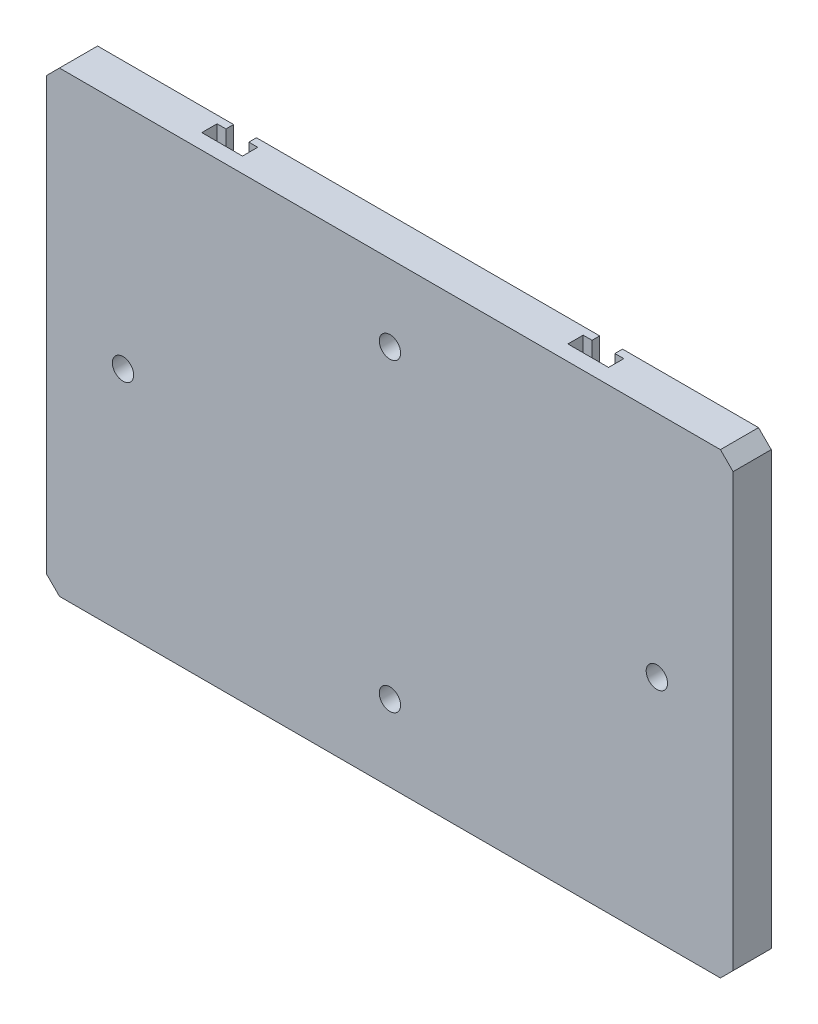
ISO-10303-21;
HEADER;
FILE_DESCRIPTION(('STEP AP214'),'2;1');
FILE_NAME('part.step','',(''),(''),'','','');
FILE_SCHEMA(('AUTOMOTIVE_DESIGN { 1 0 10303 214 1 1 1 1 }'));
ENDSEC;
DATA;
#1=APPLICATION_CONTEXT('core data for automotive mechanical design processes');
#2=APPLICATION_PROTOCOL_DEFINITION('international standard','automotive_design',2000,#1);
#3=PRODUCT_CONTEXT('',#1,'mechanical');
#4=PRODUCT('Part','Part','',(#3));
#5=PRODUCT_RELATED_PRODUCT_CATEGORY('part','',(#4));
#6=PRODUCT_DEFINITION_FORMATION('','',#4);
#7=PRODUCT_DEFINITION_CONTEXT('part definition',#1,'design');
#8=PRODUCT_DEFINITION('design','',#6,#7);
#9=PRODUCT_DEFINITION_SHAPE('','',#8);
#10=(LENGTH_UNIT() NAMED_UNIT(*) SI_UNIT(.MILLI.,.METRE.));
#11=(NAMED_UNIT(*) PLANE_ANGLE_UNIT() SI_UNIT($,.RADIAN.));
#12=(NAMED_UNIT(*) SI_UNIT($,.STERADIAN.) SOLID_ANGLE_UNIT());
#13=UNCERTAINTY_MEASURE_WITH_UNIT(LENGTH_MEASURE(1.E-05),#10,'distance_accuracy_value','');
#14=(GEOMETRIC_REPRESENTATION_CONTEXT(3) GLOBAL_UNCERTAINTY_ASSIGNED_CONTEXT((#13)) GLOBAL_UNIT_ASSIGNED_CONTEXT((#10,
#11,#12)) REPRESENTATION_CONTEXT('',''));
#15=CARTESIAN_POINT('',(0.,0.,0.));
#16=DIRECTION('',(0.,0.,1.));
#17=DIRECTION('',(1.,0.,0.));
#18=AXIS2_PLACEMENT_3D('',#15,#16,#17);
#19=CARTESIAN_POINT('',(0.,0.,0.));
#20=DIRECTION('',(0.,0.,-1.));
#21=DIRECTION('',(-1.,0.,0.));
#22=AXIS2_PLACEMENT_3D('',#19,#20,#21);
#23=PLANE('',#22);
#24=DIRECTION('',(0.,1.,0.));
#25=VECTOR('',#24,1.);
#26=CARTESIAN_POINT('',(202.5,0.,0.));
#27=LINE('',#26,#25);
#28=CARTESIAN_POINT('',(202.5,0.,0.));
#29=VERTEX_POINT('',#28);
#30=CARTESIAN_POINT('',(202.5,180.,0.));
#31=VERTEX_POINT('',#30);
#32=EDGE_CURVE('E254',#29,#31,#27,.T.);
#33=ORIENTED_EDGE('',*,*,#32,.F.);
#34=DIRECTION('',(1.,0.,0.));
#35=VECTOR('',#34,1.);
#36=CARTESIAN_POINT('',(0.,0.,0.));
#37=LINE('',#36,#35);
#38=CARTESIAN_POINT('',(67.5,0.,0.));
#39=VERTEX_POINT('',#38);
#40=EDGE_CURVE('E223',#39,#29,#37,.T.);
#41=ORIENTED_EDGE('',*,*,#40,.F.);
#42=DIRECTION('',(0.,1.,0.));
#43=VECTOR('',#42,1.);
#44=CARTESIAN_POINT('',(67.5,0.,0.));
#45=LINE('',#44,#43);
#46=CARTESIAN_POINT('',(67.5,180.,0.));
#47=VERTEX_POINT('',#46);
#48=EDGE_CURVE('E315',#39,#47,#45,.T.);
#49=ORIENTED_EDGE('',*,*,#48,.T.);
#50=DIRECTION('',(-1.,0.,0.));
#51=VECTOR('',#50,1.);
#52=CARTESIAN_POINT('',(0.,180.,0.));
#53=LINE('',#52,#51);
#54=EDGE_CURVE('E59',#31,#47,#53,.T.);
#55=ORIENTED_EDGE('',*,*,#54,.F.);
#56=EDGE_LOOP('',(#33,#41,#49,#55));
#57=FACE_BOUND('',#56,.T.);
#58=CARTESIAN_POINT('',(135.,150.,0.));
#59=DIRECTION('',(0.,0.,-1.));
#60=DIRECTION('',(-1.,0.,0.));
#61=AXIS2_PLACEMENT_3D('',#58,#59,#60);
#62=CIRCLE('',#61,7.50000000000001);
#63=CARTESIAN_POINT('',(127.5,150.,0.));
#64=VERTEX_POINT('',#63);
#65=EDGE_CURVE('E360',#64,#64,#62,.T.);
#66=ORIENTED_EDGE('',*,*,#65,.F.);
#67=EDGE_LOOP('',(#66));
#68=FACE_BOUND('',#67,.T.);
#69=CARTESIAN_POINT('',(135.,30.0000000000001,0.));
#70=DIRECTION('',(0.,0.,-1.));
#71=DIRECTION('',(-1.,0.,0.));
#72=AXIS2_PLACEMENT_3D('',#69,#70,#71);
#73=CIRCLE('',#72,7.50000000000001);
#74=CARTESIAN_POINT('',(127.5,30.0000000000001,0.));
#75=VERTEX_POINT('',#74);
#76=EDGE_CURVE('E348',#75,#75,#73,.T.);
#77=ORIENTED_EDGE('',*,*,#76,.F.);
#78=EDGE_LOOP('',(#77));
#79=FACE_BOUND('',#78,.T.);
#80=ADVANCED_FACE('F36',(#57,#68,#79),#23,.T.);
#81=DIRECTION('',(0.,1.,0.));
#82=VECTOR('',#81,1.);
#83=CARTESIAN_POINT('',(58.5,0.,0.));
#84=LINE('',#83,#82);
#85=CARTESIAN_POINT('',(58.5,0.,0.));
#86=VERTEX_POINT('',#85);
#87=CARTESIAN_POINT('',(58.5,180.,0.));
#88=VERTEX_POINT('',#87);
#89=EDGE_CURVE('E313',#86,#88,#84,.T.);
#90=ORIENTED_EDGE('',*,*,#89,.F.);
#91=CARTESIAN_POINT('',(5.00000000000006,0.,0.));
#92=VERTEX_POINT('',#91);
#93=EDGE_CURVE('E390',#92,#86,#37,.T.);
#94=ORIENTED_EDGE('',*,*,#93,.F.);
#95=DIRECTION('',(0.707106781186545,-0.70710678118655,0.));
#96=VECTOR('',#95,1.);
#97=CARTESIAN_POINT('',(2.50000000000004,2.50000000000003,0.));
#98=LINE('',#97,#96);
#99=CARTESIAN_POINT('',(0.,5.00000000000009,0.));
#100=VERTEX_POINT('',#99);
#101=EDGE_CURVE('E411',#92,#100,#98,.F.);
#102=ORIENTED_EDGE('',*,*,#101,.T.);
#103=DIRECTION('',(0.,-1.,0.));
#104=VECTOR('',#103,1.);
#105=CARTESIAN_POINT('',(0.,0.,0.));
#106=LINE('',#105,#104);
#107=CARTESIAN_POINT('',(0.,175.,0.));
#108=VERTEX_POINT('',#107);
#109=EDGE_CURVE('E372',#108,#100,#106,.T.);
#110=ORIENTED_EDGE('',*,*,#109,.F.);
#111=DIRECTION('',(-0.707106781186549,-0.707106781186546,0.));
#112=VECTOR('',#111,1.);
#113=CARTESIAN_POINT('',(-87.5,87.5000000000005,0.));
#114=LINE('',#113,#112);
#115=CARTESIAN_POINT('',(5.00000000000003,180.,0.));
#116=VERTEX_POINT('',#115);
#117=EDGE_CURVE('E403',#108,#116,#114,.F.);
#118=ORIENTED_EDGE('',*,*,#117,.T.);
#119=EDGE_CURVE('E396',#88,#116,#53,.T.);
#120=ORIENTED_EDGE('',*,*,#119,.F.);
#121=EDGE_LOOP('',(#90,#94,#102,#110,#118,#120));
#122=FACE_BOUND('',#121,.T.);
#123=CARTESIAN_POINT('',(30.,90.0000000000007,0.));
#124=DIRECTION('',(0.,0.,-1.));
#125=DIRECTION('',(-1.,0.,0.));
#126=AXIS2_PLACEMENT_3D('',#123,#124,#125);
#127=CIRCLE('',#126,7.5);
#128=CARTESIAN_POINT('',(22.5,90.0000000000007,0.));
#129=VERTEX_POINT('',#128);
#130=EDGE_CURVE('E336',#129,#129,#127,.T.);
#131=ORIENTED_EDGE('',*,*,#130,.F.);
#132=EDGE_LOOP('',(#131));
#133=FACE_BOUND('',#132,.T.);
#134=ADVANCED_FACE('F449',(#122,#133),#23,.T.);
#135=CARTESIAN_POINT('',(0.,0.,15.));
#136=DIRECTION('',(1.,0.,0.));
#137=DIRECTION('',(0.,0.,-1.));
#138=AXIS2_PLACEMENT_3D('',#135,#136,#137);
#139=PLANE('',#138);
#140=ORIENTED_EDGE('',*,*,#109,.T.);
#141=DIRECTION('',(0.,0.,1.));
#142=VECTOR('',#141,1.);
#143=CARTESIAN_POINT('',(0.,5.00000000000009,15.));
#144=LINE('',#143,#142);
#145=CARTESIAN_POINT('',(0.,5.00000000000009,15.));
#146=VERTEX_POINT('',#145);
#147=EDGE_CURVE('E416',#100,#146,#144,.T.);
#148=ORIENTED_EDGE('',*,*,#147,.T.);
#149=DIRECTION('',(0.,-1.,0.));
#150=VECTOR('',#149,1.);
#151=CARTESIAN_POINT('',(0.,0.,15.));
#152=LINE('',#151,#150);
#153=CARTESIAN_POINT('',(0.,175.,15.));
#154=VERTEX_POINT('',#153);
#155=EDGE_CURVE('E373',#154,#146,#152,.T.);
#156=ORIENTED_EDGE('',*,*,#155,.F.);
#157=DIRECTION('',(0.,0.,-1.));
#158=VECTOR('',#157,1.);
#159=CARTESIAN_POINT('',(0.,175.,15.));
#160=LINE('',#159,#158);
#161=EDGE_CURVE('E413',#154,#108,#160,.T.);
#162=ORIENTED_EDGE('',*,*,#161,.T.);
#163=EDGE_LOOP('',(#140,#148,#156,#162));
#164=FACE_BOUND('',#163,.T.);
#165=ADVANCED_FACE('F445',(#164),#139,.F.);
#166=CARTESIAN_POINT('',(0.,0.,15.));
#167=DIRECTION('',(0.,1.,0.));
#168=DIRECTION('',(0.,0.,1.));
#169=AXIS2_PLACEMENT_3D('',#166,#167,#168);
#170=PLANE('',#169);
#171=ORIENTED_EDGE('',*,*,#40,.T.);
#172=DIRECTION('',(0.,0.,1.));
#173=VECTOR('',#172,1.);
#174=CARTESIAN_POINT('',(202.5,0.,3.));
#175=LINE('',#174,#173);
#176=CARTESIAN_POINT('',(202.5,0.,3.));
#177=VERTEX_POINT('',#176);
#178=EDGE_CURVE('E202',#29,#177,#175,.T.);
#179=ORIENTED_EDGE('',*,*,#178,.T.);
#180=DIRECTION('',(-1.,0.,0.));
#181=VECTOR('',#180,1.);
#182=CARTESIAN_POINT('',(202.5,0.,3.));
#183=LINE('',#182,#181);
#184=CARTESIAN_POINT('',(199.,0.,3.));
#185=VERTEX_POINT('',#184);
#186=EDGE_CURVE('E212',#177,#185,#183,.T.);
#187=ORIENTED_EDGE('',*,*,#186,.T.);
#188=DIRECTION('',(0.,0.,1.));
#189=VECTOR('',#188,1.);
#190=CARTESIAN_POINT('',(199.,0.,9.));
#191=LINE('',#190,#189);
#192=CARTESIAN_POINT('',(199.,0.,9.));
#193=VERTEX_POINT('',#192);
#194=EDGE_CURVE('E217',#185,#193,#191,.T.);
#195=ORIENTED_EDGE('',*,*,#194,.T.);
#196=DIRECTION('',(1.,0.,0.));
#197=VECTOR('',#196,1.);
#198=CARTESIAN_POINT('',(215.,0.,9.));
#199=LINE('',#198,#197);
#200=CARTESIAN_POINT('',(215.,0.,9.));
#201=VERTEX_POINT('',#200);
#202=EDGE_CURVE('E229',#193,#201,#199,.T.);
#203=ORIENTED_EDGE('',*,*,#202,.T.);
#204=DIRECTION('',(0.,0.,-1.));
#205=VECTOR('',#204,1.);
#206=CARTESIAN_POINT('',(215.,0.,9.));
#207=LINE('',#206,#205);
#208=CARTESIAN_POINT('',(215.,0.,3.));
#209=VERTEX_POINT('',#208);
#210=EDGE_CURVE('E232',#201,#209,#207,.T.);
#211=ORIENTED_EDGE('',*,*,#210,.T.);
#212=DIRECTION('',(-1.,0.,0.));
#213=VECTOR('',#212,1.);
#214=CARTESIAN_POINT('',(215.,0.,3.));
#215=LINE('',#214,#213);
#216=CARTESIAN_POINT('',(211.5,0.,3.));
#217=VERTEX_POINT('',#216);
#218=EDGE_CURVE('E235',#209,#217,#215,.T.);
#219=ORIENTED_EDGE('',*,*,#218,.T.);
#220=DIRECTION('',(0.,0.,-1.));
#221=VECTOR('',#220,1.);
#222=CARTESIAN_POINT('',(211.5,0.,3.));
#223=LINE('',#222,#221);
#224=CARTESIAN_POINT('',(211.5,0.,0.));
#225=VERTEX_POINT('',#224);
#226=EDGE_CURVE('E209',#217,#225,#223,.T.);
#227=ORIENTED_EDGE('',*,*,#226,.T.);
#228=CARTESIAN_POINT('',(265.,0.,0.));
#229=VERTEX_POINT('',#228);
#230=EDGE_CURVE('E389',#225,#229,#37,.T.);
#231=ORIENTED_EDGE('',*,*,#230,.T.);
#232=DIRECTION('',(0.,0.,1.));
#233=VECTOR('',#232,1.);
#234=CARTESIAN_POINT('',(265.,0.,15.));
#235=LINE('',#234,#233);
#236=CARTESIAN_POINT('',(265.,0.,15.));
#237=VERTEX_POINT('',#236);
#238=EDGE_CURVE('E386',#229,#237,#235,.T.);
#239=ORIENTED_EDGE('',*,*,#238,.T.);
#240=DIRECTION('',(1.,0.,0.));
#241=VECTOR('',#240,1.);
#242=CARTESIAN_POINT('',(0.,0.,15.));
#243=LINE('',#242,#241);
#244=CARTESIAN_POINT('',(5.00000000000006,0.,15.));
#245=VERTEX_POINT('',#244);
#246=EDGE_CURVE('E376',#245,#237,#243,.T.);
#247=ORIENTED_EDGE('',*,*,#246,.F.);
#248=DIRECTION('',(0.,0.,-1.));
#249=VECTOR('',#248,1.);
#250=CARTESIAN_POINT('',(5.00000000000006,0.,15.));
#251=LINE('',#250,#249);
#252=EDGE_CURVE('E400',#245,#92,#251,.T.);
#253=ORIENTED_EDGE('',*,*,#252,.T.);
#254=ORIENTED_EDGE('',*,*,#93,.T.);
#255=DIRECTION('',(0.,0.,1.));
#256=VECTOR('',#255,1.);
#257=CARTESIAN_POINT('',(58.5,0.,3.));
#258=LINE('',#257,#256);
#259=CARTESIAN_POINT('',(58.5,0.,3.));
#260=VERTEX_POINT('',#259);
#261=EDGE_CURVE('E283',#86,#260,#258,.T.);
#262=ORIENTED_EDGE('',*,*,#261,.T.);
#263=DIRECTION('',(-1.,0.,0.));
#264=VECTOR('',#263,1.);
#265=CARTESIAN_POINT('',(55.,0.,3.));
#266=LINE('',#265,#264);
#267=CARTESIAN_POINT('',(55.,0.,3.));
#268=VERTEX_POINT('',#267);
#269=EDGE_CURVE('E286',#260,#268,#266,.T.);
#270=ORIENTED_EDGE('',*,*,#269,.T.);
#271=DIRECTION('',(0.,0.,1.));
#272=VECTOR('',#271,1.);
#273=CARTESIAN_POINT('',(55.,0.,9.));
#274=LINE('',#273,#272);
#275=CARTESIAN_POINT('',(55.,0.,9.));
#276=VERTEX_POINT('',#275);
#277=EDGE_CURVE('E268',#268,#276,#274,.T.);
#278=ORIENTED_EDGE('',*,*,#277,.T.);
#279=DIRECTION('',(1.,0.,0.));
#280=VECTOR('',#279,1.);
#281=CARTESIAN_POINT('',(55.,0.,9.));
#282=LINE('',#281,#280);
#283=CARTESIAN_POINT('',(71.,0.,9.));
#284=VERTEX_POINT('',#283);
#285=EDGE_CURVE('E271',#276,#284,#282,.T.);
#286=ORIENTED_EDGE('',*,*,#285,.T.);
#287=DIRECTION('',(0.,0.,-1.));
#288=VECTOR('',#287,1.);
#289=CARTESIAN_POINT('',(71.,0.,9.));
#290=LINE('',#289,#288);
#291=CARTESIAN_POINT('',(71.,0.,3.));
#292=VERTEX_POINT('',#291);
#293=EDGE_CURVE('E275',#284,#292,#290,.T.);
#294=ORIENTED_EDGE('',*,*,#293,.T.);
#295=DIRECTION('',(-1.,0.,0.));
#296=VECTOR('',#295,1.);
#297=CARTESIAN_POINT('',(67.5,0.,3.));
#298=LINE('',#297,#296);
#299=CARTESIAN_POINT('',(67.5,0.,3.));
#300=VERTEX_POINT('',#299);
#301=EDGE_CURVE('E278',#292,#300,#298,.T.);
#302=ORIENTED_EDGE('',*,*,#301,.T.);
#303=DIRECTION('',(0.,0.,-1.));
#304=VECTOR('',#303,1.);
#305=CARTESIAN_POINT('',(67.5,0.,3.));
#306=LINE('',#305,#304);
#307=EDGE_CURVE('E281',#300,#39,#306,.T.);
#308=ORIENTED_EDGE('',*,*,#307,.T.);
#309=EDGE_LOOP('',(#171,#179,#187,#195,#203,#211,#219,#227,#231,#239,#247,#253,#254,#262,#270,
#278,#286,#294,#302,#308));
#310=FACE_BOUND('',#309,.T.);
#311=ADVANCED_FACE('F220',(#310),#170,.F.);
#312=CARTESIAN_POINT('',(270.,0.,15.));
#313=DIRECTION('',(-1.,0.,0.));
#314=DIRECTION('',(0.,0.,1.));
#315=AXIS2_PLACEMENT_3D('',#312,#313,#314);
#316=PLANE('',#315);
#317=DIRECTION('',(0.,1.,0.));
#318=VECTOR('',#317,1.);
#319=CARTESIAN_POINT('',(270.,0.,15.));
#320=LINE('',#319,#318);
#321=CARTESIAN_POINT('',(270.,5.00000000000006,15.));
#322=VERTEX_POINT('',#321);
#323=CARTESIAN_POINT('',(270.,175.,15.));
#324=VERTEX_POINT('',#323);
#325=EDGE_CURVE('E380',#322,#324,#320,.T.);
#326=ORIENTED_EDGE('',*,*,#325,.F.);
#327=DIRECTION('',(0.,0.,-1.));
#328=VECTOR('',#327,1.);
#329=CARTESIAN_POINT('',(270.,5.00000000000006,15.));
#330=LINE('',#329,#328);
#331=CARTESIAN_POINT('',(270.,5.00000000000012,0.));
#332=VERTEX_POINT('',#331);
#333=EDGE_CURVE('E428',#322,#332,#330,.T.);
#334=ORIENTED_EDGE('',*,*,#333,.T.);
#335=DIRECTION('',(0.,1.,0.));
#336=VECTOR('',#335,1.);
#337=CARTESIAN_POINT('',(270.,0.,0.));
#338=LINE('',#337,#336);
#339=CARTESIAN_POINT('',(270.,175.,0.));
#340=VERTEX_POINT('',#339);
#341=EDGE_CURVE('E393',#332,#340,#338,.T.);
#342=ORIENTED_EDGE('',*,*,#341,.T.);
#343=DIRECTION('',(0.,0.,1.));
#344=VECTOR('',#343,1.);
#345=CARTESIAN_POINT('',(270.,175.,15.));
#346=LINE('',#345,#344);
#347=EDGE_CURVE('E426',#340,#324,#346,.T.);
#348=ORIENTED_EDGE('',*,*,#347,.T.);
#349=EDGE_LOOP('',(#326,#334,#342,#348));
#350=FACE_BOUND('',#349,.T.);
#351=ADVANCED_FACE('F465',(#350),#316,.F.);
#352=CARTESIAN_POINT('',(0.,180.,15.));
#353=DIRECTION('',(0.,-1.,0.));
#354=DIRECTION('',(0.,0.,-1.));
#355=AXIS2_PLACEMENT_3D('',#352,#353,#354);
#356=PLANE('',#355);
#357=DIRECTION('',(-1.,0.,0.));
#358=VECTOR('',#357,1.);
#359=CARTESIAN_POINT('',(202.5,180.,3.));
#360=LINE('',#359,#358);
#361=CARTESIAN_POINT('',(202.5,180.,3.));
#362=VERTEX_POINT('',#361);
#363=CARTESIAN_POINT('',(199.,180.,3.));
#364=VERTEX_POINT('',#363);
#365=EDGE_CURVE('E241',#362,#364,#360,.T.);
#366=ORIENTED_EDGE('',*,*,#365,.F.);
#367=DIRECTION('',(0.,0.,1.));
#368=VECTOR('',#367,1.);
#369=CARTESIAN_POINT('',(202.5,180.,3.));
#370=LINE('',#369,#368);
#371=EDGE_CURVE('E204',#31,#362,#370,.T.);
#372=ORIENTED_EDGE('',*,*,#371,.F.);
#373=ORIENTED_EDGE('',*,*,#54,.T.);
#374=DIRECTION('',(0.,0.,-1.));
#375=VECTOR('',#374,1.);
#376=CARTESIAN_POINT('',(67.5,180.,3.));
#377=LINE('',#376,#375);
#378=CARTESIAN_POINT('',(67.5,180.,3.));
#379=VERTEX_POINT('',#378);
#380=EDGE_CURVE('E301',#379,#47,#377,.T.);
#381=ORIENTED_EDGE('',*,*,#380,.F.);
#382=DIRECTION('',(-1.,0.,0.));
#383=VECTOR('',#382,1.);
#384=CARTESIAN_POINT('',(67.5,180.,3.));
#385=LINE('',#384,#383);
#386=CARTESIAN_POINT('',(71.,180.,3.));
#387=VERTEX_POINT('',#386);
#388=EDGE_CURVE('E298',#387,#379,#385,.T.);
#389=ORIENTED_EDGE('',*,*,#388,.F.);
#390=DIRECTION('',(0.,0.,-1.));
#391=VECTOR('',#390,1.);
#392=CARTESIAN_POINT('',(71.,180.,9.));
#393=LINE('',#392,#391);
#394=CARTESIAN_POINT('',(71.,180.,9.));
#395=VERTEX_POINT('',#394);
#396=EDGE_CURVE('E295',#395,#387,#393,.T.);
#397=ORIENTED_EDGE('',*,*,#396,.F.);
#398=DIRECTION('',(1.,0.,0.));
#399=VECTOR('',#398,1.);
#400=CARTESIAN_POINT('',(55.,180.,9.));
#401=LINE('',#400,#399);
#402=CARTESIAN_POINT('',(55.,180.,9.));
#403=VERTEX_POINT('',#402);
#404=EDGE_CURVE('E292',#403,#395,#401,.T.);
#405=ORIENTED_EDGE('',*,*,#404,.F.);
#406=DIRECTION('',(0.,0.,1.));
#407=VECTOR('',#406,1.);
#408=CARTESIAN_POINT('',(55.,180.,9.));
#409=LINE('',#408,#407);
#410=CARTESIAN_POINT('',(55.,180.,3.));
#411=VERTEX_POINT('',#410);
#412=EDGE_CURVE('E256',#411,#403,#409,.T.);
#413=ORIENTED_EDGE('',*,*,#412,.F.);
#414=DIRECTION('',(-1.,0.,0.));
#415=VECTOR('',#414,1.);
#416=CARTESIAN_POINT('',(55.,180.,3.));
#417=LINE('',#416,#415);
#418=CARTESIAN_POINT('',(58.5,180.,3.));
#419=VERTEX_POINT('',#418);
#420=EDGE_CURVE('E272',#419,#411,#417,.T.);
#421=ORIENTED_EDGE('',*,*,#420,.F.);
#422=DIRECTION('',(0.,0.,1.));
#423=VECTOR('',#422,1.);
#424=CARTESIAN_POINT('',(58.5,180.,3.));
#425=LINE('',#424,#423);
#426=EDGE_CURVE('E303',#88,#419,#425,.T.);
#427=ORIENTED_EDGE('',*,*,#426,.F.);
#428=ORIENTED_EDGE('',*,*,#119,.T.);
#429=DIRECTION('',(0.,0.,1.));
#430=VECTOR('',#429,1.);
#431=CARTESIAN_POINT('',(5.00000000000003,180.,15.));
#432=LINE('',#431,#430);
#433=CARTESIAN_POINT('',(5.00000000000003,180.,15.));
#434=VERTEX_POINT('',#433);
#435=EDGE_CURVE('E44',#116,#434,#432,.T.);
#436=ORIENTED_EDGE('',*,*,#435,.T.);
#437=DIRECTION('',(-1.,0.,0.));
#438=VECTOR('',#437,1.);
#439=CARTESIAN_POINT('',(0.,180.,15.));
#440=LINE('',#439,#438);
#441=CARTESIAN_POINT('',(265.,180.,15.));
#442=VERTEX_POINT('',#441);
#443=EDGE_CURVE('E383',#442,#434,#440,.T.);
#444=ORIENTED_EDGE('',*,*,#443,.F.);
#445=DIRECTION('',(0.,0.,-1.));
#446=VECTOR('',#445,1.);
#447=CARTESIAN_POINT('',(265.,180.,15.));
#448=LINE('',#447,#446);
#449=CARTESIAN_POINT('',(265.,180.,0.));
#450=VERTEX_POINT('',#449);
#451=EDGE_CURVE('E11',#442,#450,#448,.T.);
#452=ORIENTED_EDGE('',*,*,#451,.T.);
#453=CARTESIAN_POINT('',(211.5,180.,0.));
#454=VERTEX_POINT('',#453);
#455=EDGE_CURVE('E377',#450,#454,#53,.T.);
#456=ORIENTED_EDGE('',*,*,#455,.T.);
#457=DIRECTION('',(0.,0.,-1.));
#458=VECTOR('',#457,1.);
#459=CARTESIAN_POINT('',(211.5,180.,3.));
#460=LINE('',#459,#458);
#461=CARTESIAN_POINT('',(211.5,180.,3.));
#462=VERTEX_POINT('',#461);
#463=EDGE_CURVE('E51',#462,#454,#460,.T.);
#464=ORIENTED_EDGE('',*,*,#463,.F.);
#465=DIRECTION('',(-1.,0.,0.));
#466=VECTOR('',#465,1.);
#467=CARTESIAN_POINT('',(215.,180.,3.));
#468=LINE('',#467,#466);
#469=CARTESIAN_POINT('',(215.,180.,3.));
#470=VERTEX_POINT('',#469);
#471=EDGE_CURVE('E225',#470,#462,#468,.T.);
#472=ORIENTED_EDGE('',*,*,#471,.F.);
#473=DIRECTION('',(0.,0.,-1.));
#474=VECTOR('',#473,1.);
#475=CARTESIAN_POINT('',(215.,180.,9.));
#476=LINE('',#475,#474);
#477=CARTESIAN_POINT('',(215.,180.,9.));
#478=VERTEX_POINT('',#477);
#479=EDGE_CURVE('E249',#478,#470,#476,.T.);
#480=ORIENTED_EDGE('',*,*,#479,.F.);
#481=DIRECTION('',(1.,0.,0.));
#482=VECTOR('',#481,1.);
#483=CARTESIAN_POINT('',(215.,180.,9.));
#484=LINE('',#483,#482);
#485=CARTESIAN_POINT('',(199.,180.,9.));
#486=VERTEX_POINT('',#485);
#487=EDGE_CURVE('E246',#486,#478,#484,.T.);
#488=ORIENTED_EDGE('',*,*,#487,.F.);
#489=DIRECTION('',(0.,0.,1.));
#490=VECTOR('',#489,1.);
#491=CARTESIAN_POINT('',(199.,180.,9.));
#492=LINE('',#491,#490);
#493=EDGE_CURVE('E243',#364,#486,#492,.T.);
#494=ORIENTED_EDGE('',*,*,#493,.F.);
#495=EDGE_LOOP('',(#366,#372,#373,#381,#389,#397,#405,#413,#421,#427,#428,#436,#444,#452,#456,
#464,#472,#480,#488,#494));
#496=FACE_BOUND('',#495,.T.);
#497=ADVANCED_FACE('F432',(#496),#356,.F.);
#498=CARTESIAN_POINT('',(0.,0.,15.));
#499=DIRECTION('',(0.,0.,-1.));
#500=DIRECTION('',(-1.,0.,0.));
#501=AXIS2_PLACEMENT_3D('',#498,#499,#500);
#502=PLANE('',#501);
#503=CARTESIAN_POINT('',(240.,90.0000000000015,15.));
#504=DIRECTION('',(0.,0.,-1.));
#505=DIRECTION('',(-1.,0.,0.));
#506=AXIS2_PLACEMENT_3D('',#503,#504,#505);
#507=CIRCLE('',#506,4.20000000000001);
#508=CARTESIAN_POINT('',(235.8,90.0000000000015,15.));
#509=VERTEX_POINT('',#508);
#510=EDGE_CURVE('E333',#509,#509,#507,.T.);
#511=ORIENTED_EDGE('',*,*,#510,.T.);
#512=EDGE_LOOP('',(#511));
#513=FACE_BOUND('',#512,.T.);
#514=CARTESIAN_POINT('',(30.,90.0000000000007,15.));
#515=DIRECTION('',(0.,0.,-1.));
#516=DIRECTION('',(-1.,0.,0.));
#517=AXIS2_PLACEMENT_3D('',#514,#515,#516);
#518=CIRCLE('',#517,4.2);
#519=CARTESIAN_POINT('',(25.8,90.0000000000007,15.));
#520=VERTEX_POINT('',#519);
#521=EDGE_CURVE('E345',#520,#520,#518,.T.);
#522=ORIENTED_EDGE('',*,*,#521,.T.);
#523=EDGE_LOOP('',(#522));
#524=FACE_BOUND('',#523,.T.);
#525=CARTESIAN_POINT('',(135.,30.0000000000001,15.));
#526=DIRECTION('',(0.,0.,-1.));
#527=DIRECTION('',(-1.,0.,0.));
#528=AXIS2_PLACEMENT_3D('',#525,#526,#527);
#529=CIRCLE('',#528,4.20000000000001);
#530=CARTESIAN_POINT('',(130.8,30.0000000000001,15.));
#531=VERTEX_POINT('',#530);
#532=EDGE_CURVE('E357',#531,#531,#529,.T.);
#533=ORIENTED_EDGE('',*,*,#532,.T.);
#534=EDGE_LOOP('',(#533));
#535=FACE_BOUND('',#534,.T.);
#536=CARTESIAN_POINT('',(135.,150.,15.));
#537=DIRECTION('',(0.,0.,-1.));
#538=DIRECTION('',(-1.,0.,0.));
#539=AXIS2_PLACEMENT_3D('',#536,#537,#538);
#540=CIRCLE('',#539,4.20000000000001);
#541=CARTESIAN_POINT('',(130.8,150.,15.));
#542=VERTEX_POINT('',#541);
#543=EDGE_CURVE('E369',#542,#542,#540,.T.);
#544=ORIENTED_EDGE('',*,*,#543,.T.);
#545=EDGE_LOOP('',(#544));
#546=FACE_BOUND('',#545,.T.);
#547=ORIENTED_EDGE('',*,*,#155,.T.);
#548=DIRECTION('',(-0.707106781186545,0.70710678118655,0.));
#549=VECTOR('',#548,1.);
#550=CARTESIAN_POINT('',(5.00000000000006,0.,15.));
#551=LINE('',#550,#549);
#552=EDGE_CURVE('E424',#146,#245,#551,.F.);
#553=ORIENTED_EDGE('',*,*,#552,.T.);
#554=ORIENTED_EDGE('',*,*,#246,.T.);
#555=DIRECTION('',(-0.707106781186548,-0.707106781186548,0.));
#556=VECTOR('',#555,1.);
#557=CARTESIAN_POINT('',(270.,5.00000000000006,15.));
#558=LINE('',#557,#556);
#559=EDGE_CURVE('E422',#237,#322,#558,.F.);
#560=ORIENTED_EDGE('',*,*,#559,.T.);
#561=ORIENTED_EDGE('',*,*,#325,.T.);
#562=DIRECTION('',(0.707106781186549,-0.707106781186546,0.));
#563=VECTOR('',#562,1.);
#564=CARTESIAN_POINT('',(265.,180.,15.));
#565=LINE('',#564,#563);
#566=EDGE_CURVE('E420',#324,#442,#565,.F.);
#567=ORIENTED_EDGE('',*,*,#566,.T.);
#568=ORIENTED_EDGE('',*,*,#443,.T.);
#569=DIRECTION('',(0.707106781186549,0.707106781186546,0.));
#570=VECTOR('',#569,1.);
#571=CARTESIAN_POINT('',(0.,175.,15.));
#572=LINE('',#571,#570);
#573=EDGE_CURVE('E418',#434,#154,#572,.F.);
#574=ORIENTED_EDGE('',*,*,#573,.T.);
#575=EDGE_LOOP('',(#547,#553,#554,#560,#561,#567,#568,#574));
#576=FACE_BOUND('',#575,.T.);
#577=ADVANCED_FACE('F439',(#513,#524,#535,#546,#576),#502,.F.);
#578=DIRECTION('',(0.,1.,0.));
#579=VECTOR('',#578,1.);
#580=CARTESIAN_POINT('',(211.5,0.,0.));
#581=LINE('',#580,#579);
#582=EDGE_CURVE('E257',#225,#454,#581,.T.);
#583=ORIENTED_EDGE('',*,*,#582,.T.);
#584=ORIENTED_EDGE('',*,*,#455,.F.);
#585=DIRECTION('',(-0.707106781186549,0.707106781186546,0.));
#586=VECTOR('',#585,1.);
#587=CARTESIAN_POINT('',(222.499999999999,222.500000000001,0.));
#588=LINE('',#587,#586);
#589=EDGE_CURVE('E406',#450,#340,#588,.F.);
#590=ORIENTED_EDGE('',*,*,#589,.T.);
#591=ORIENTED_EDGE('',*,*,#341,.F.);
#592=DIRECTION('',(0.707106781186548,0.707106781186548,0.));
#593=VECTOR('',#592,1.);
#594=CARTESIAN_POINT('',(132.5,-132.5,0.));
#595=LINE('',#594,#593);
#596=EDGE_CURVE('E408',#332,#229,#595,.F.);
#597=ORIENTED_EDGE('',*,*,#596,.T.);
#598=ORIENTED_EDGE('',*,*,#230,.F.);
#599=EDGE_LOOP('',(#583,#584,#590,#591,#597,#598));
#600=FACE_BOUND('',#599,.T.);
#601=CARTESIAN_POINT('',(240.,90.0000000000015,0.));
#602=DIRECTION('',(0.,0.,-1.));
#603=DIRECTION('',(-1.,0.,0.));
#604=AXIS2_PLACEMENT_3D('',#601,#602,#603);
#605=CIRCLE('',#604,7.50000000000001);
#606=CARTESIAN_POINT('',(232.5,90.0000000000015,0.));
#607=VERTEX_POINT('',#606);
#608=EDGE_CURVE('E310',#607,#607,#605,.T.);
#609=ORIENTED_EDGE('',*,*,#608,.F.);
#610=EDGE_LOOP('',(#609));
#611=FACE_BOUND('',#610,.T.);
#612=ADVANCED_FACE('F468',(#600,#611),#23,.T.);
#613=CARTESIAN_POINT('',(5.00000000000006,0.,15.));
#614=DIRECTION('',(0.70710678118655,0.707106781186545,0.));
#615=DIRECTION('',(0.,0.,-1.));
#616=AXIS2_PLACEMENT_3D('',#613,#614,#615);
#617=PLANE('',#616);
#618=ORIENTED_EDGE('',*,*,#552,.F.);
#619=ORIENTED_EDGE('',*,*,#147,.F.);
#620=ORIENTED_EDGE('',*,*,#101,.F.);
#621=ORIENTED_EDGE('',*,*,#252,.F.);
#622=EDGE_LOOP('',(#618,#619,#620,#621));
#623=FACE_BOUND('',#622,.T.);
#624=ADVANCED_FACE('F455',(#623),#617,.F.);
#625=CARTESIAN_POINT('',(270.,5.00000000000006,15.));
#626=DIRECTION('',(-0.707106781186547,0.707106781186547,0.));
#627=DIRECTION('',(0.,0.,-1.));
#628=AXIS2_PLACEMENT_3D('',#625,#626,#627);
#629=PLANE('',#628);
#630=ORIENTED_EDGE('',*,*,#559,.F.);
#631=ORIENTED_EDGE('',*,*,#238,.F.);
#632=ORIENTED_EDGE('',*,*,#596,.F.);
#633=ORIENTED_EDGE('',*,*,#333,.F.);
#634=EDGE_LOOP('',(#630,#631,#632,#633));
#635=FACE_BOUND('',#634,.T.);
#636=ADVANCED_FACE('F462',(#635),#629,.F.);
#637=CARTESIAN_POINT('',(265.,180.,15.));
#638=DIRECTION('',(-0.707106781186546,-0.707106781186549,0.));
#639=DIRECTION('',(0.,0.,-1.));
#640=AXIS2_PLACEMENT_3D('',#637,#638,#639);
#641=PLANE('',#640);
#642=ORIENTED_EDGE('',*,*,#566,.F.);
#643=ORIENTED_EDGE('',*,*,#347,.F.);
#644=ORIENTED_EDGE('',*,*,#589,.F.);
#645=ORIENTED_EDGE('',*,*,#451,.F.);
#646=EDGE_LOOP('',(#642,#643,#644,#645));
#647=FACE_BOUND('',#646,.T.);
#648=ADVANCED_FACE('F473',(#647),#641,.F.);
#649=CARTESIAN_POINT('',(0.,175.,15.));
#650=DIRECTION('',(0.707106781186546,-0.707106781186549,0.));
#651=DIRECTION('',(0.,0.,-1.));
#652=AXIS2_PLACEMENT_3D('',#649,#650,#651);
#653=PLANE('',#652);
#654=ORIENTED_EDGE('',*,*,#573,.F.);
#655=ORIENTED_EDGE('',*,*,#435,.F.);
#656=ORIENTED_EDGE('',*,*,#117,.F.);
#657=ORIENTED_EDGE('',*,*,#161,.F.);
#658=EDGE_LOOP('',(#654,#655,#656,#657));
#659=FACE_BOUND('',#658,.T.);
#660=ADVANCED_FACE('F38',(#659),#653,.F.);
#661=CARTESIAN_POINT('',(135.,150.,0.));
#662=DIRECTION('',(0.,0.,-1.));
#663=DIRECTION('',(-1.,0.,0.));
#664=AXIS2_PLACEMENT_3D('',#661,#662,#663);
#665=CYLINDRICAL_SURFACE('',#664,4.20000000000001);
#666=ORIENTED_EDGE('',*,*,#543,.F.);
#667=EDGE_LOOP('',(#666));
#668=FACE_BOUND('',#667,.T.);
#669=CARTESIAN_POINT('',(135.,150.,8.));
#670=DIRECTION('',(0.,0.,-1.));
#671=DIRECTION('',(-1.,0.,0.));
#672=AXIS2_PLACEMENT_3D('',#669,#670,#671);
#673=CIRCLE('',#672,4.20000000000001);
#674=CARTESIAN_POINT('',(130.8,150.,8.));
#675=VERTEX_POINT('',#674);
#676=EDGE_CURVE('E366',#675,#675,#673,.T.);
#677=ORIENTED_EDGE('',*,*,#676,.T.);
#678=EDGE_LOOP('',(#677));
#679=FACE_BOUND('',#678,.T.);
#680=ADVANCED_FACE('F521',(#668,#679),#665,.F.);
#681=CARTESIAN_POINT('',(139.2,150.,8.));
#682=DIRECTION('',(0.,0.,1.));
#683=DIRECTION('',(1.,0.,0.));
#684=AXIS2_PLACEMENT_3D('',#681,#682,#683);
#685=PLANE('',#684);
#686=ORIENTED_EDGE('',*,*,#676,.F.);
#687=EDGE_LOOP('',(#686));
#688=FACE_BOUND('',#687,.T.);
#689=CARTESIAN_POINT('',(135.,150.,8.));
#690=DIRECTION('',(0.,0.,-1.));
#691=DIRECTION('',(-1.,0.,0.));
#692=AXIS2_PLACEMENT_3D('',#689,#690,#691);
#693=CIRCLE('',#692,7.50000000000001);
#694=CARTESIAN_POINT('',(127.5,150.,8.));
#695=VERTEX_POINT('',#694);
#696=EDGE_CURVE('E363',#695,#695,#693,.T.);
#697=ORIENTED_EDGE('',*,*,#696,.T.);
#698=EDGE_LOOP('',(#697));
#699=FACE_BOUND('',#698,.T.);
#700=ADVANCED_FACE('F524',(#688,#699),#685,.F.);
#701=CARTESIAN_POINT('',(135.,150.,0.));
#702=DIRECTION('',(0.,0.,-1.));
#703=DIRECTION('',(-1.,0.,0.));
#704=AXIS2_PLACEMENT_3D('',#701,#702,#703);
#705=CYLINDRICAL_SURFACE('',#704,7.50000000000001);
#706=ORIENTED_EDGE('',*,*,#696,.F.);
#707=EDGE_LOOP('',(#706));
#708=FACE_BOUND('',#707,.T.);
#709=ORIENTED_EDGE('',*,*,#65,.T.);
#710=EDGE_LOOP('',(#709));
#711=FACE_BOUND('',#710,.T.);
#712=ADVANCED_FACE('F528',(#708,#711),#705,.F.);
#713=CARTESIAN_POINT('',(135.,30.0000000000001,0.));
#714=DIRECTION('',(0.,0.,-1.));
#715=DIRECTION('',(-1.,0.,0.));
#716=AXIS2_PLACEMENT_3D('',#713,#714,#715);
#717=CYLINDRICAL_SURFACE('',#716,4.20000000000001);
#718=ORIENTED_EDGE('',*,*,#532,.F.);
#719=EDGE_LOOP('',(#718));
#720=FACE_BOUND('',#719,.T.);
#721=CARTESIAN_POINT('',(135.,30.0000000000001,8.));
#722=DIRECTION('',(0.,0.,-1.));
#723=DIRECTION('',(-1.,0.,0.));
#724=AXIS2_PLACEMENT_3D('',#721,#722,#723);
#725=CIRCLE('',#724,4.20000000000001);
#726=CARTESIAN_POINT('',(130.8,30.0000000000001,8.));
#727=VERTEX_POINT('',#726);
#728=EDGE_CURVE('E354',#727,#727,#725,.T.);
#729=ORIENTED_EDGE('',*,*,#728,.T.);
#730=EDGE_LOOP('',(#729));
#731=FACE_BOUND('',#730,.T.);
#732=ADVANCED_FACE('F532',(#720,#731),#717,.F.);
#733=CARTESIAN_POINT('',(139.2,30.0000000000001,8.));
#734=DIRECTION('',(0.,0.,1.));
#735=DIRECTION('',(1.,0.,0.));
#736=AXIS2_PLACEMENT_3D('',#733,#734,#735);
#737=PLANE('',#736);
#738=ORIENTED_EDGE('',*,*,#728,.F.);
#739=EDGE_LOOP('',(#738));
#740=FACE_BOUND('',#739,.T.);
#741=CARTESIAN_POINT('',(135.,30.0000000000001,8.));
#742=DIRECTION('',(0.,0.,-1.));
#743=DIRECTION('',(-1.,0.,0.));
#744=AXIS2_PLACEMENT_3D('',#741,#742,#743);
#745=CIRCLE('',#744,7.50000000000001);
#746=CARTESIAN_POINT('',(127.5,30.0000000000001,8.));
#747=VERTEX_POINT('',#746);
#748=EDGE_CURVE('E351',#747,#747,#745,.T.);
#749=ORIENTED_EDGE('',*,*,#748,.T.);
#750=EDGE_LOOP('',(#749));
#751=FACE_BOUND('',#750,.T.);
#752=ADVANCED_FACE('F536',(#740,#751),#737,.F.);
#753=CARTESIAN_POINT('',(135.,30.0000000000001,0.));
#754=DIRECTION('',(0.,0.,-1.));
#755=DIRECTION('',(-1.,0.,0.));
#756=AXIS2_PLACEMENT_3D('',#753,#754,#755);
#757=CYLINDRICAL_SURFACE('',#756,7.50000000000001);
#758=ORIENTED_EDGE('',*,*,#748,.F.);
#759=EDGE_LOOP('',(#758));
#760=FACE_BOUND('',#759,.T.);
#761=ORIENTED_EDGE('',*,*,#76,.T.);
#762=EDGE_LOOP('',(#761));
#763=FACE_BOUND('',#762,.T.);
#764=ADVANCED_FACE('F540',(#760,#763),#757,.F.);
#765=CARTESIAN_POINT('',(30.,90.0000000000007,0.));
#766=DIRECTION('',(0.,0.,-1.));
#767=DIRECTION('',(-1.,0.,0.));
#768=AXIS2_PLACEMENT_3D('',#765,#766,#767);
#769=CYLINDRICAL_SURFACE('',#768,4.2);
#770=ORIENTED_EDGE('',*,*,#521,.F.);
#771=EDGE_LOOP('',(#770));
#772=FACE_BOUND('',#771,.T.);
#773=CARTESIAN_POINT('',(30.,90.0000000000007,8.));
#774=DIRECTION('',(0.,0.,-1.));
#775=DIRECTION('',(-1.,0.,0.));
#776=AXIS2_PLACEMENT_3D('',#773,#774,#775);
#777=CIRCLE('',#776,4.2);
#778=CARTESIAN_POINT('',(25.8,90.0000000000007,8.));
#779=VERTEX_POINT('',#778);
#780=EDGE_CURVE('E342',#779,#779,#777,.T.);
#781=ORIENTED_EDGE('',*,*,#780,.T.);
#782=EDGE_LOOP('',(#781));
#783=FACE_BOUND('',#782,.T.);
#784=ADVANCED_FACE('F544',(#772,#783),#769,.F.);
#785=CARTESIAN_POINT('',(34.2,90.0000000000007,8.));
#786=DIRECTION('',(0.,0.,1.));
#787=DIRECTION('',(1.,0.,0.));
#788=AXIS2_PLACEMENT_3D('',#785,#786,#787);
#789=PLANE('',#788);
#790=ORIENTED_EDGE('',*,*,#780,.F.);
#791=EDGE_LOOP('',(#790));
#792=FACE_BOUND('',#791,.T.);
#793=CARTESIAN_POINT('',(30.,90.0000000000007,8.));
#794=DIRECTION('',(0.,0.,-1.));
#795=DIRECTION('',(-1.,0.,0.));
#796=AXIS2_PLACEMENT_3D('',#793,#794,#795);
#797=CIRCLE('',#796,7.5);
#798=CARTESIAN_POINT('',(22.5,90.0000000000007,8.));
#799=VERTEX_POINT('',#798);
#800=EDGE_CURVE('E339',#799,#799,#797,.T.);
#801=ORIENTED_EDGE('',*,*,#800,.T.);
#802=EDGE_LOOP('',(#801));
#803=FACE_BOUND('',#802,.T.);
#804=ADVANCED_FACE('F548',(#792,#803),#789,.F.);
#805=CARTESIAN_POINT('',(30.,90.0000000000007,0.));
#806=DIRECTION('',(0.,0.,-1.));
#807=DIRECTION('',(-1.,0.,0.));
#808=AXIS2_PLACEMENT_3D('',#805,#806,#807);
#809=CYLINDRICAL_SURFACE('',#808,7.5);
#810=ORIENTED_EDGE('',*,*,#800,.F.);
#811=EDGE_LOOP('',(#810));
#812=FACE_BOUND('',#811,.T.);
#813=ORIENTED_EDGE('',*,*,#130,.T.);
#814=EDGE_LOOP('',(#813));
#815=FACE_BOUND('',#814,.T.);
#816=ADVANCED_FACE('F552',(#812,#815),#809,.F.);
#817=CARTESIAN_POINT('',(240.,90.0000000000015,0.));
#818=DIRECTION('',(0.,0.,-1.));
#819=DIRECTION('',(-1.,0.,0.));
#820=AXIS2_PLACEMENT_3D('',#817,#818,#819);
#821=CYLINDRICAL_SURFACE('',#820,4.20000000000001);
#822=ORIENTED_EDGE('',*,*,#510,.F.);
#823=EDGE_LOOP('',(#822));
#824=FACE_BOUND('',#823,.T.);
#825=CARTESIAN_POINT('',(240.,90.0000000000015,8.));
#826=DIRECTION('',(0.,0.,-1.));
#827=DIRECTION('',(-1.,0.,0.));
#828=AXIS2_PLACEMENT_3D('',#825,#826,#827);
#829=CIRCLE('',#828,4.20000000000001);
#830=CARTESIAN_POINT('',(235.8,90.0000000000015,8.));
#831=VERTEX_POINT('',#830);
#832=EDGE_CURVE('E330',#831,#831,#829,.T.);
#833=ORIENTED_EDGE('',*,*,#832,.T.);
#834=EDGE_LOOP('',(#833));
#835=FACE_BOUND('',#834,.T.);
#836=ADVANCED_FACE('F556',(#824,#835),#821,.F.);
#837=CARTESIAN_POINT('',(244.2,90.0000000000015,8.));
#838=DIRECTION('',(0.,0.,1.));
#839=DIRECTION('',(1.,0.,0.));
#840=AXIS2_PLACEMENT_3D('',#837,#838,#839);
#841=PLANE('',#840);
#842=ORIENTED_EDGE('',*,*,#832,.F.);
#843=EDGE_LOOP('',(#842));
#844=FACE_BOUND('',#843,.T.);
#845=CARTESIAN_POINT('',(240.,90.0000000000015,8.));
#846=DIRECTION('',(0.,0.,-1.));
#847=DIRECTION('',(-1.,0.,0.));
#848=AXIS2_PLACEMENT_3D('',#845,#846,#847);
#849=CIRCLE('',#848,7.50000000000001);
#850=CARTESIAN_POINT('',(232.5,90.0000000000015,8.));
#851=VERTEX_POINT('',#850);
#852=EDGE_CURVE('E327',#851,#851,#849,.T.);
#853=ORIENTED_EDGE('',*,*,#852,.T.);
#854=EDGE_LOOP('',(#853));
#855=FACE_BOUND('',#854,.T.);
#856=ADVANCED_FACE('F560',(#844,#855),#841,.F.);
#857=CARTESIAN_POINT('',(240.,90.0000000000015,0.));
#858=DIRECTION('',(0.,0.,-1.));
#859=DIRECTION('',(-1.,0.,0.));
#860=AXIS2_PLACEMENT_3D('',#857,#858,#859);
#861=CYLINDRICAL_SURFACE('',#860,7.50000000000001);
#862=ORIENTED_EDGE('',*,*,#852,.F.);
#863=EDGE_LOOP('',(#862));
#864=FACE_BOUND('',#863,.T.);
#865=ORIENTED_EDGE('',*,*,#608,.T.);
#866=EDGE_LOOP('',(#865));
#867=FACE_BOUND('',#866,.T.);
#868=ADVANCED_FACE('F564',(#864,#867),#861,.F.);
#869=CARTESIAN_POINT('',(55.,0.,9.));
#870=DIRECTION('',(-1.,0.,0.));
#871=DIRECTION('',(0.,0.,1.));
#872=AXIS2_PLACEMENT_3D('',#869,#870,#871);
#873=PLANE('',#872);
#874=ORIENTED_EDGE('',*,*,#412,.T.);
#875=DIRECTION('',(0.,1.,0.));
#876=VECTOR('',#875,1.);
#877=CARTESIAN_POINT('',(55.,0.,9.));
#878=LINE('',#877,#876);
#879=EDGE_CURVE('E289',#276,#403,#878,.T.);
#880=ORIENTED_EDGE('',*,*,#879,.F.);
#881=ORIENTED_EDGE('',*,*,#277,.F.);
#882=DIRECTION('',(0.,1.,0.));
#883=VECTOR('',#882,1.);
#884=CARTESIAN_POINT('',(55.,0.,3.));
#885=LINE('',#884,#883);
#886=EDGE_CURVE('E308',#268,#411,#885,.T.);
#887=ORIENTED_EDGE('',*,*,#886,.T.);
#888=EDGE_LOOP('',(#874,#880,#881,#887));
#889=FACE_BOUND('',#888,.T.);
#890=ADVANCED_FACE('F568',(#889),#873,.F.);
#891=CARTESIAN_POINT('',(55.,0.,3.));
#892=DIRECTION('',(0.,0.,-1.));
#893=DIRECTION('',(-1.,0.,0.));
#894=AXIS2_PLACEMENT_3D('',#891,#892,#893);
#895=PLANE('',#894);
#896=ORIENTED_EDGE('',*,*,#420,.T.);
#897=ORIENTED_EDGE('',*,*,#886,.F.);
#898=ORIENTED_EDGE('',*,*,#269,.F.);
#899=DIRECTION('',(0.,1.,0.));
#900=VECTOR('',#899,1.);
#901=CARTESIAN_POINT('',(58.5,0.,3.));
#902=LINE('',#901,#900);
#903=EDGE_CURVE('E311',#260,#419,#902,.T.);
#904=ORIENTED_EDGE('',*,*,#903,.T.);
#905=EDGE_LOOP('',(#896,#897,#898,#904));
#906=FACE_BOUND('',#905,.T.);
#907=ADVANCED_FACE('F572',(#906),#895,.F.);
#908=CARTESIAN_POINT('',(58.5,0.,3.));
#909=DIRECTION('',(-1.,0.,0.));
#910=DIRECTION('',(0.,0.,1.));
#911=AXIS2_PLACEMENT_3D('',#908,#909,#910);
#912=PLANE('',#911);
#913=ORIENTED_EDGE('',*,*,#426,.T.);
#914=ORIENTED_EDGE('',*,*,#903,.F.);
#915=ORIENTED_EDGE('',*,*,#261,.F.);
#916=ORIENTED_EDGE('',*,*,#89,.T.);
#917=EDGE_LOOP('',(#913,#914,#915,#916));
#918=FACE_BOUND('',#917,.T.);
#919=ADVANCED_FACE('F588',(#918),#912,.F.);
#920=CARTESIAN_POINT('',(67.5,0.,3.));
#921=DIRECTION('',(1.,0.,0.));
#922=DIRECTION('',(0.,0.,-1.));
#923=AXIS2_PLACEMENT_3D('',#920,#921,#922);
#924=PLANE('',#923);
#925=ORIENTED_EDGE('',*,*,#380,.T.);
#926=ORIENTED_EDGE('',*,*,#48,.F.);
#927=ORIENTED_EDGE('',*,*,#307,.F.);
#928=DIRECTION('',(0.,1.,0.));
#929=VECTOR('',#928,1.);
#930=CARTESIAN_POINT('',(67.5,0.,3.));
#931=LINE('',#930,#929);
#932=EDGE_CURVE('E318',#300,#379,#931,.T.);
#933=ORIENTED_EDGE('',*,*,#932,.T.);
#934=EDGE_LOOP('',(#925,#926,#927,#933));
#935=FACE_BOUND('',#934,.T.);
#936=ADVANCED_FACE('F584',(#935),#924,.F.);
#937=CARTESIAN_POINT('',(67.5,0.,3.));
#938=DIRECTION('',(0.,0.,-1.));
#939=DIRECTION('',(-1.,0.,0.));
#940=AXIS2_PLACEMENT_3D('',#937,#938,#939);
#941=PLANE('',#940);
#942=ORIENTED_EDGE('',*,*,#388,.T.);
#943=ORIENTED_EDGE('',*,*,#932,.F.);
#944=ORIENTED_EDGE('',*,*,#301,.F.);
#945=DIRECTION('',(0.,1.,0.));
#946=VECTOR('',#945,1.);
#947=CARTESIAN_POINT('',(71.,0.,3.));
#948=LINE('',#947,#946);
#949=EDGE_CURVE('E320',#292,#387,#948,.T.);
#950=ORIENTED_EDGE('',*,*,#949,.T.);
#951=EDGE_LOOP('',(#942,#943,#944,#950));
#952=FACE_BOUND('',#951,.T.);
#953=ADVANCED_FACE('F580',(#952),#941,.F.);
#954=CARTESIAN_POINT('',(71.,0.,9.));
#955=DIRECTION('',(1.,0.,0.));
#956=DIRECTION('',(0.,0.,-1.));
#957=AXIS2_PLACEMENT_3D('',#954,#955,#956);
#958=PLANE('',#957);
#959=ORIENTED_EDGE('',*,*,#396,.T.);
#960=ORIENTED_EDGE('',*,*,#949,.F.);
#961=ORIENTED_EDGE('',*,*,#293,.F.);
#962=DIRECTION('',(0.,1.,0.));
#963=VECTOR('',#962,1.);
#964=CARTESIAN_POINT('',(71.,0.,9.));
#965=LINE('',#964,#963);
#966=EDGE_CURVE('E322',#284,#395,#965,.T.);
#967=ORIENTED_EDGE('',*,*,#966,.T.);
#968=EDGE_LOOP('',(#959,#960,#961,#967));
#969=FACE_BOUND('',#968,.T.);
#970=ADVANCED_FACE('F576',(#969),#958,.F.);
#971=CARTESIAN_POINT('',(55.,0.,9.));
#972=DIRECTION('',(0.,0.,1.));
#973=DIRECTION('',(1.,0.,0.));
#974=AXIS2_PLACEMENT_3D('',#971,#972,#973);
#975=PLANE('',#974);
#976=ORIENTED_EDGE('',*,*,#404,.T.);
#977=ORIENTED_EDGE('',*,*,#966,.F.);
#978=ORIENTED_EDGE('',*,*,#285,.F.);
#979=ORIENTED_EDGE('',*,*,#879,.T.);
#980=EDGE_LOOP('',(#976,#977,#978,#979));
#981=FACE_BOUND('',#980,.T.);
#982=ADVANCED_FACE('F498',(#981),#975,.F.);
#983=CARTESIAN_POINT('',(202.5,0.,3.));
#984=DIRECTION('',(-1.,0.,0.));
#985=DIRECTION('',(0.,0.,1.));
#986=AXIS2_PLACEMENT_3D('',#983,#984,#985);
#987=PLANE('',#986);
#988=ORIENTED_EDGE('',*,*,#371,.T.);
#989=DIRECTION('',(0.,1.,0.));
#990=VECTOR('',#989,1.);
#991=CARTESIAN_POINT('',(202.5,0.,3.));
#992=LINE('',#991,#990);
#993=EDGE_CURVE('E198',#177,#362,#992,.T.);
#994=ORIENTED_EDGE('',*,*,#993,.F.);
#995=ORIENTED_EDGE('',*,*,#178,.F.);
#996=ORIENTED_EDGE('',*,*,#32,.T.);
#997=EDGE_LOOP('',(#988,#994,#995,#996));
#998=FACE_BOUND('',#997,.T.);
#999=ADVANCED_FACE('F200',(#998),#987,.F.);
#1000=CARTESIAN_POINT('',(211.5,0.,3.));
#1001=DIRECTION('',(1.,0.,0.));
#1002=DIRECTION('',(0.,0.,-1.));
#1003=AXIS2_PLACEMENT_3D('',#1000,#1001,#1002);
#1004=PLANE('',#1003);
#1005=ORIENTED_EDGE('',*,*,#463,.T.);
#1006=ORIENTED_EDGE('',*,*,#582,.F.);
#1007=ORIENTED_EDGE('',*,*,#226,.F.);
#1008=DIRECTION('',(0.,1.,0.));
#1009=VECTOR('',#1008,1.);
#1010=CARTESIAN_POINT('',(211.5,0.,3.));
#1011=LINE('',#1010,#1009);
#1012=EDGE_CURVE('E259',#217,#462,#1011,.T.);
#1013=ORIENTED_EDGE('',*,*,#1012,.T.);
#1014=EDGE_LOOP('',(#1005,#1006,#1007,#1013));
#1015=FACE_BOUND('',#1014,.T.);
#1016=ADVANCED_FACE('F490',(#1015),#1004,.F.);
#1017=CARTESIAN_POINT('',(215.,0.,3.));
#1018=DIRECTION('',(0.,0.,-1.));
#1019=DIRECTION('',(-1.,0.,0.));
#1020=AXIS2_PLACEMENT_3D('',#1017,#1018,#1019);
#1021=PLANE('',#1020);
#1022=ORIENTED_EDGE('',*,*,#471,.T.);
#1023=ORIENTED_EDGE('',*,*,#1012,.F.);
#1024=ORIENTED_EDGE('',*,*,#218,.F.);
#1025=DIRECTION('',(0.,1.,0.));
#1026=VECTOR('',#1025,1.);
#1027=CARTESIAN_POINT('',(215.,0.,3.));
#1028=LINE('',#1027,#1026);
#1029=EDGE_CURVE('E261',#209,#470,#1028,.T.);
#1030=ORIENTED_EDGE('',*,*,#1029,.T.);
#1031=EDGE_LOOP('',(#1022,#1023,#1024,#1030));
#1032=FACE_BOUND('',#1031,.T.);
#1033=ADVANCED_FACE('F478',(#1032),#1021,.F.);
#1034=CARTESIAN_POINT('',(215.,0.,9.));
#1035=DIRECTION('',(1.,0.,0.));
#1036=DIRECTION('',(0.,0.,-1.));
#1037=AXIS2_PLACEMENT_3D('',#1034,#1035,#1036);
#1038=PLANE('',#1037);
#1039=ORIENTED_EDGE('',*,*,#479,.T.);
#1040=ORIENTED_EDGE('',*,*,#1029,.F.);
#1041=ORIENTED_EDGE('',*,*,#210,.F.);
#1042=DIRECTION('',(0.,1.,0.));
#1043=VECTOR('',#1042,1.);
#1044=CARTESIAN_POINT('',(215.,0.,9.));
#1045=LINE('',#1044,#1043);
#1046=EDGE_CURVE('E263',#201,#478,#1045,.T.);
#1047=ORIENTED_EDGE('',*,*,#1046,.T.);
#1048=EDGE_LOOP('',(#1039,#1040,#1041,#1047));
#1049=FACE_BOUND('',#1048,.T.);
#1050=ADVANCED_FACE('F483',(#1049),#1038,.F.);
#1051=CARTESIAN_POINT('',(215.,0.,9.));
#1052=DIRECTION('',(0.,0.,1.));
#1053=DIRECTION('',(1.,0.,0.));
#1054=AXIS2_PLACEMENT_3D('',#1051,#1052,#1053);
#1055=PLANE('',#1054);
#1056=ORIENTED_EDGE('',*,*,#487,.T.);
#1057=ORIENTED_EDGE('',*,*,#1046,.F.);
#1058=ORIENTED_EDGE('',*,*,#202,.F.);
#1059=DIRECTION('',(0.,1.,0.));
#1060=VECTOR('',#1059,1.);
#1061=CARTESIAN_POINT('',(199.,0.,9.));
#1062=LINE('',#1061,#1060);
#1063=EDGE_CURVE('E265',#193,#486,#1062,.T.);
#1064=ORIENTED_EDGE('',*,*,#1063,.T.);
#1065=EDGE_LOOP('',(#1056,#1057,#1058,#1064));
#1066=FACE_BOUND('',#1065,.T.);
#1067=ADVANCED_FACE('F486',(#1066),#1055,.F.);
#1068=CARTESIAN_POINT('',(199.,0.,9.));
#1069=DIRECTION('',(-1.,0.,0.));
#1070=DIRECTION('',(0.,0.,1.));
#1071=AXIS2_PLACEMENT_3D('',#1068,#1069,#1070);
#1072=PLANE('',#1071);
#1073=ORIENTED_EDGE('',*,*,#493,.T.);
#1074=ORIENTED_EDGE('',*,*,#1063,.F.);
#1075=ORIENTED_EDGE('',*,*,#194,.F.);
#1076=DIRECTION('',(0.,1.,0.));
#1077=VECTOR('',#1076,1.);
#1078=CARTESIAN_POINT('',(199.,0.,3.));
#1079=LINE('',#1078,#1077);
#1080=EDGE_CURVE('E208',#185,#364,#1079,.T.);
#1081=ORIENTED_EDGE('',*,*,#1080,.T.);
#1082=EDGE_LOOP('',(#1073,#1074,#1075,#1081));
#1083=FACE_BOUND('',#1082,.T.);
#1084=ADVANCED_FACE('F489',(#1083),#1072,.F.);
#1085=CARTESIAN_POINT('',(202.5,0.,3.));
#1086=DIRECTION('',(0.,0.,-1.));
#1087=DIRECTION('',(-1.,0.,0.));
#1088=AXIS2_PLACEMENT_3D('',#1085,#1086,#1087);
#1089=PLANE('',#1088);
#1090=ORIENTED_EDGE('',*,*,#365,.T.);
#1091=ORIENTED_EDGE('',*,*,#1080,.F.);
#1092=ORIENTED_EDGE('',*,*,#186,.F.);
#1093=ORIENTED_EDGE('',*,*,#993,.T.);
#1094=EDGE_LOOP('',(#1090,#1091,#1092,#1093));
#1095=FACE_BOUND('',#1094,.T.);
#1096=ADVANCED_FACE('F213',(#1095),#1089,.F.);
#1097=CLOSED_SHELL('',(#80,#134,#165,#311,#351,#497,#577,#612,#624,#636,#648,#660,#680,#700,
#712,#732,#752,#764,#784,#804,#816,#836,#856,#868,#890,#907,#919,#936,#953,#970,#982,#999,#1016,
#1033,#1050,#1067,#1084,#1096));
#1098=MANIFOLD_SOLID_BREP('B2',#1097);
#1099=ADVANCED_BREP_SHAPE_REPRESENTATION('',(#18,#1098),#14);
#1100=SHAPE_DEFINITION_REPRESENTATION(#9,#1099);
ENDSEC;
END-ISO-10303-21;
